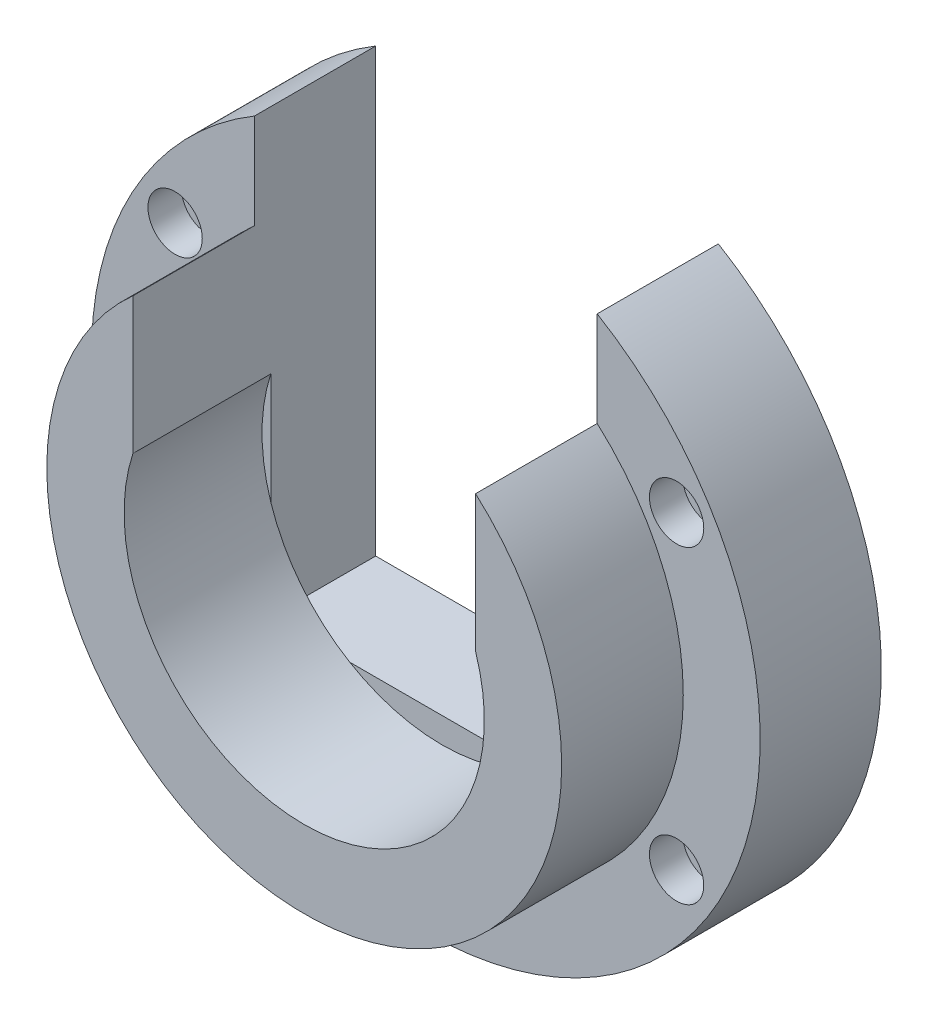
ISO-10303-21;
HEADER;
FILE_DESCRIPTION(('STEP AP214'),'2;1');
FILE_NAME('part.step','',(''),(''),'','','');
FILE_SCHEMA(('AUTOMOTIVE_DESIGN { 1 0 10303 214 1 1 1 1 }'));
ENDSEC;
DATA;
#1=APPLICATION_CONTEXT('core data for automotive mechanical design processes');
#2=APPLICATION_PROTOCOL_DEFINITION('international standard','automotive_design',2000,#1);
#3=PRODUCT_CONTEXT('',#1,'mechanical');
#4=PRODUCT('Part','Part','',(#3));
#5=PRODUCT_RELATED_PRODUCT_CATEGORY('part','',(#4));
#6=PRODUCT_DEFINITION_FORMATION('','',#4);
#7=PRODUCT_DEFINITION_CONTEXT('part definition',#1,'design');
#8=PRODUCT_DEFINITION('design','',#6,#7);
#9=PRODUCT_DEFINITION_SHAPE('','',#8);
#10=(LENGTH_UNIT() NAMED_UNIT(*) SI_UNIT(.MILLI.,.METRE.));
#11=(NAMED_UNIT(*) PLANE_ANGLE_UNIT() SI_UNIT($,.RADIAN.));
#12=(NAMED_UNIT(*) SI_UNIT($,.STERADIAN.) SOLID_ANGLE_UNIT());
#13=UNCERTAINTY_MEASURE_WITH_UNIT(LENGTH_MEASURE(1.E-05),#10,'distance_accuracy_value','');
#14=(GEOMETRIC_REPRESENTATION_CONTEXT(3) GLOBAL_UNCERTAINTY_ASSIGNED_CONTEXT((#13)) GLOBAL_UNIT_ASSIGNED_CONTEXT((#10,
#11,#12)) REPRESENTATION_CONTEXT('',''));
#15=CARTESIAN_POINT('',(0.,0.,0.));
#16=DIRECTION('',(0.,0.,1.));
#17=DIRECTION('',(1.,0.,0.));
#18=AXIS2_PLACEMENT_3D('',#15,#16,#17);
#19=CARTESIAN_POINT('',(30.,18.5084440188796,0.));
#20=DIRECTION('',(0.,0.,1.));
#21=DIRECTION('',(1.,0.,0.));
#22=AXIS2_PLACEMENT_3D('',#19,#20,#21);
#23=CYLINDRICAL_SURFACE('',#22,1.7);
#24=CARTESIAN_POINT('',(30.,18.5084440188796,0.));
#25=DIRECTION('',(0.,0.,1.));
#26=DIRECTION('',(1.,0.,0.));
#27=AXIS2_PLACEMENT_3D('',#24,#25,#26);
#28=CIRCLE('',#27,1.7);
#29=CARTESIAN_POINT('',(31.7,18.5084440188796,0.));
#30=VERTEX_POINT('',#29);
#31=EDGE_CURVE('E153',#30,#30,#28,.T.);
#32=CARTESIAN_POINT('',(30.,18.5084440188796,10.5));
#33=DIRECTION('',(0.,0.,1.));
#34=DIRECTION('',(1.,0.,0.));
#35=AXIS2_PLACEMENT_3D('',#32,#33,#34);
#36=CIRCLE('',#35,1.7);
#37=CARTESIAN_POINT('',(31.7,18.5084440188796,10.5));
#38=VERTEX_POINT('',#37);
#39=EDGE_CURVE('E45',#38,#38,#36,.F.);
#40=CARTESIAN_POINT('',(31.7,18.5084440188796,0.));
#41=CARTESIAN_POINT('',(31.7,18.5084440188796,0.109375));
#42=CARTESIAN_POINT('',(31.7,18.5084440188796,0.21875));
#43=CARTESIAN_POINT('',(31.7,18.5084440188796,0.4375));
#44=CARTESIAN_POINT('',(31.7,18.5084440188796,0.546875));
#45=CARTESIAN_POINT('',(31.7,18.5084440188796,0.765625));
#46=CARTESIAN_POINT('',(31.7,18.5084440188796,0.875));
#47=CARTESIAN_POINT('',(31.7,18.5084440188796,1.09375));
#48=CARTESIAN_POINT('',(31.7,18.5084440188796,1.203125));
#49=CARTESIAN_POINT('',(31.7,18.5084440188796,1.421875));
#50=CARTESIAN_POINT('',(31.7,18.5084440188796,1.53125));
#51=CARTESIAN_POINT('',(31.7,18.5084440188796,1.75));
#52=CARTESIAN_POINT('',(31.7,18.5084440188796,1.859375));
#53=CARTESIAN_POINT('',(31.7,18.5084440188796,2.078125));
#54=CARTESIAN_POINT('',(31.7,18.5084440188796,2.1875));
#55=CARTESIAN_POINT('',(31.7,18.5084440188796,2.40625));
#56=CARTESIAN_POINT('',(31.7,18.5084440188796,2.515625));
#57=CARTESIAN_POINT('',(31.7,18.5084440188796,2.734375));
#58=CARTESIAN_POINT('',(31.7,18.5084440188796,2.84375));
#59=CARTESIAN_POINT('',(31.7,18.5084440188796,3.0625));
#60=CARTESIAN_POINT('',(31.7,18.5084440188796,3.171875));
#61=CARTESIAN_POINT('',(31.7,18.5084440188796,3.390625));
#62=CARTESIAN_POINT('',(31.7,18.5084440188796,3.5));
#63=CARTESIAN_POINT('',(31.7,18.5084440188796,3.71875));
#64=CARTESIAN_POINT('',(31.7,18.5084440188796,3.828125));
#65=CARTESIAN_POINT('',(31.7,18.5084440188796,4.046875));
#66=CARTESIAN_POINT('',(31.7,18.5084440188796,4.15625));
#67=CARTESIAN_POINT('',(31.7,18.5084440188796,4.375));
#68=CARTESIAN_POINT('',(31.7,18.5084440188796,4.484375));
#69=CARTESIAN_POINT('',(31.7,18.5084440188796,4.703125));
#70=CARTESIAN_POINT('',(31.7,18.5084440188796,4.8125));
#71=CARTESIAN_POINT('',(31.7,18.5084440188796,5.03125));
#72=CARTESIAN_POINT('',(31.7,18.5084440188796,5.140625));
#73=CARTESIAN_POINT('',(31.7,18.5084440188796,5.359375));
#74=CARTESIAN_POINT('',(31.7,18.5084440188796,5.46875));
#75=CARTESIAN_POINT('',(31.7,18.5084440188796,5.6875));
#76=CARTESIAN_POINT('',(31.7,18.5084440188796,5.796875));
#77=CARTESIAN_POINT('',(31.7,18.5084440188796,6.015625));
#78=CARTESIAN_POINT('',(31.7,18.5084440188796,6.125));
#79=CARTESIAN_POINT('',(31.7,18.5084440188796,6.34375));
#80=CARTESIAN_POINT('',(31.7,18.5084440188796,6.453125));
#81=CARTESIAN_POINT('',(31.7,18.5084440188796,6.671875));
#82=CARTESIAN_POINT('',(31.7,18.5084440188796,6.78125));
#83=CARTESIAN_POINT('',(31.7,18.5084440188796,7.));
#84=CARTESIAN_POINT('',(31.7,18.5084440188796,7.109375));
#85=CARTESIAN_POINT('',(31.7,18.5084440188796,7.328125));
#86=CARTESIAN_POINT('',(31.7,18.5084440188796,7.4375));
#87=CARTESIAN_POINT('',(31.7,18.5084440188796,7.65625));
#88=CARTESIAN_POINT('',(31.7,18.5084440188796,7.765625));
#89=CARTESIAN_POINT('',(31.7,18.5084440188796,7.984375));
#90=CARTESIAN_POINT('',(31.7,18.5084440188796,8.09375));
#91=CARTESIAN_POINT('',(31.7,18.5084440188796,8.3125));
#92=CARTESIAN_POINT('',(31.7,18.5084440188796,8.421875));
#93=CARTESIAN_POINT('',(31.7,18.5084440188796,8.640625));
#94=CARTESIAN_POINT('',(31.7,18.5084440188796,8.75));
#95=CARTESIAN_POINT('',(31.7,18.5084440188796,8.96875));
#96=CARTESIAN_POINT('',(31.7,18.5084440188796,9.078125));
#97=CARTESIAN_POINT('',(31.7,18.5084440188796,9.296875));
#98=CARTESIAN_POINT('',(31.7,18.5084440188796,9.40625));
#99=CARTESIAN_POINT('',(31.7,18.5084440188796,9.625));
#100=CARTESIAN_POINT('',(31.7,18.5084440188796,9.734375));
#101=CARTESIAN_POINT('',(31.7,18.5084440188796,9.953125));
#102=CARTESIAN_POINT('',(31.7,18.5084440188796,10.0625));
#103=CARTESIAN_POINT('',(31.7,18.5084440188796,10.28125));
#104=CARTESIAN_POINT('',(31.7,18.5084440188796,10.390625));
#105=CARTESIAN_POINT('',(31.7,18.5084440188796,10.5));
#106=B_SPLINE_CURVE_WITH_KNOTS('',3,(#40,#41,#42,#43,#44,#45,#46,#47,#48,#49,#50,#51,#52,#53,
#54,#55,#56,#57,#58,#59,#60,#61,#62,#63,#64,#65,#66,#67,#68,#69,#70,#71,#72,#73,#74,#75,#76,#77,
#78,#79,#80,#81,#82,#83,#84,#85,#86,#87,#88,#89,#90,#91,#92,#93,#94,#95,#96,#97,#98,#99,#100,
#101,#102,#103,#104,#105),.UNSPECIFIED.,.F.,.F.,(4,2,2,2,2,2,2,2,2,2,2,2,2,2,2,2,2,2,2,2,2,2,2,
2,2,2,2,2,2,2,2,2,4),(0.,0.328125,0.65625,0.984375,1.3125,1.640625,1.96875,2.296875,2.625,
2.953125,3.28125,3.609375,3.9375,4.265625,4.59375,4.921875,5.25,5.578125,5.90625,6.234375,
6.5625,6.890625,7.21875,7.546875,7.875,8.203125,8.53125,8.859375,9.1875,9.515625,9.84375,
10.171875,10.5),.UNSPECIFIED.);
#107=EDGE_CURVE('BSEAM41',#30,#38,#106,.T.);
#108=ORIENTED_EDGE('',*,*,#31,.F.);
#109=ORIENTED_EDGE('',*,*,#39,.F.);
#110=ORIENTED_EDGE('',*,*,#107,.T.);
#111=ORIENTED_EDGE('',*,*,#107,.F.);
#112=EDGE_LOOP('',(#108,#110,#109,#111));
#113=FACE_BOUND('',#112,.T.);
#114=ADVANCED_FACE('F41',(#113),#23,.F.);
#115=CARTESIAN_POINT('',(-30.,-18.5084440188796,0.));
#116=DIRECTION('',(0.,0.,1.));
#117=DIRECTION('',(1.,0.,0.));
#118=AXIS2_PLACEMENT_3D('',#115,#116,#117);
#119=CYLINDRICAL_SURFACE('',#118,1.7);
#120=CARTESIAN_POINT('',(-30.,-18.5084440188796,0.));
#121=DIRECTION('',(0.,0.,1.));
#122=DIRECTION('',(1.,0.,0.));
#123=AXIS2_PLACEMENT_3D('',#120,#121,#122);
#124=CIRCLE('',#123,1.7);
#125=CARTESIAN_POINT('',(-28.3,-18.5084440188796,0.));
#126=VERTEX_POINT('',#125);
#127=EDGE_CURVE('E137',#126,#126,#124,.T.);
#128=CARTESIAN_POINT('',(-30.,-18.5084440188796,10.5));
#129=DIRECTION('',(0.,0.,1.));
#130=DIRECTION('',(1.,0.,0.));
#131=AXIS2_PLACEMENT_3D('',#128,#129,#130);
#132=CIRCLE('',#131,1.7);
#133=CARTESIAN_POINT('',(-28.3,-18.5084440188796,10.5));
#134=VERTEX_POINT('',#133);
#135=EDGE_CURVE('E132',#134,#134,#132,.F.);
#136=CARTESIAN_POINT('',(-28.3,-18.5084440188796,0.));
#137=CARTESIAN_POINT('',(-28.3,-18.5084440188796,0.109375));
#138=CARTESIAN_POINT('',(-28.3,-18.5084440188796,0.21875));
#139=CARTESIAN_POINT('',(-28.3,-18.5084440188796,0.4375));
#140=CARTESIAN_POINT('',(-28.3,-18.5084440188796,0.546875));
#141=CARTESIAN_POINT('',(-28.3,-18.5084440188796,0.765625));
#142=CARTESIAN_POINT('',(-28.3,-18.5084440188796,0.875));
#143=CARTESIAN_POINT('',(-28.3,-18.5084440188796,1.09375));
#144=CARTESIAN_POINT('',(-28.3,-18.5084440188796,1.203125));
#145=CARTESIAN_POINT('',(-28.3,-18.5084440188796,1.421875));
#146=CARTESIAN_POINT('',(-28.3,-18.5084440188796,1.53125));
#147=CARTESIAN_POINT('',(-28.3,-18.5084440188796,1.75));
#148=CARTESIAN_POINT('',(-28.3,-18.5084440188796,1.859375));
#149=CARTESIAN_POINT('',(-28.3,-18.5084440188796,2.078125));
#150=CARTESIAN_POINT('',(-28.3,-18.5084440188796,2.1875));
#151=CARTESIAN_POINT('',(-28.3,-18.5084440188796,2.40625));
#152=CARTESIAN_POINT('',(-28.3,-18.5084440188796,2.515625));
#153=CARTESIAN_POINT('',(-28.3,-18.5084440188796,2.734375));
#154=CARTESIAN_POINT('',(-28.3,-18.5084440188796,2.84375));
#155=CARTESIAN_POINT('',(-28.3,-18.5084440188796,3.0625));
#156=CARTESIAN_POINT('',(-28.3,-18.5084440188796,3.171875));
#157=CARTESIAN_POINT('',(-28.3,-18.5084440188796,3.390625));
#158=CARTESIAN_POINT('',(-28.3,-18.5084440188796,3.5));
#159=CARTESIAN_POINT('',(-28.3,-18.5084440188796,3.71875));
#160=CARTESIAN_POINT('',(-28.3,-18.5084440188796,3.828125));
#161=CARTESIAN_POINT('',(-28.3,-18.5084440188796,4.046875));
#162=CARTESIAN_POINT('',(-28.3,-18.5084440188796,4.15625));
#163=CARTESIAN_POINT('',(-28.3,-18.5084440188796,4.375));
#164=CARTESIAN_POINT('',(-28.3,-18.5084440188796,4.484375));
#165=CARTESIAN_POINT('',(-28.3,-18.5084440188796,4.703125));
#166=CARTESIAN_POINT('',(-28.3,-18.5084440188796,4.8125));
#167=CARTESIAN_POINT('',(-28.3,-18.5084440188796,5.03125));
#168=CARTESIAN_POINT('',(-28.3,-18.5084440188796,5.140625));
#169=CARTESIAN_POINT('',(-28.3,-18.5084440188796,5.359375));
#170=CARTESIAN_POINT('',(-28.3,-18.5084440188796,5.46875));
#171=CARTESIAN_POINT('',(-28.3,-18.5084440188796,5.6875));
#172=CARTESIAN_POINT('',(-28.3,-18.5084440188796,5.796875));
#173=CARTESIAN_POINT('',(-28.3,-18.5084440188796,6.015625));
#174=CARTESIAN_POINT('',(-28.3,-18.5084440188796,6.125));
#175=CARTESIAN_POINT('',(-28.3,-18.5084440188796,6.34375));
#176=CARTESIAN_POINT('',(-28.3,-18.5084440188796,6.453125));
#177=CARTESIAN_POINT('',(-28.3,-18.5084440188796,6.671875));
#178=CARTESIAN_POINT('',(-28.3,-18.5084440188796,6.78125));
#179=CARTESIAN_POINT('',(-28.3,-18.5084440188796,7.));
#180=CARTESIAN_POINT('',(-28.3,-18.5084440188796,7.109375));
#181=CARTESIAN_POINT('',(-28.3,-18.5084440188796,7.328125));
#182=CARTESIAN_POINT('',(-28.3,-18.5084440188796,7.4375));
#183=CARTESIAN_POINT('',(-28.3,-18.5084440188796,7.65625));
#184=CARTESIAN_POINT('',(-28.3,-18.5084440188796,7.765625));
#185=CARTESIAN_POINT('',(-28.3,-18.5084440188796,7.984375));
#186=CARTESIAN_POINT('',(-28.3,-18.5084440188796,8.09375));
#187=CARTESIAN_POINT('',(-28.3,-18.5084440188796,8.3125));
#188=CARTESIAN_POINT('',(-28.3,-18.5084440188796,8.421875));
#189=CARTESIAN_POINT('',(-28.3,-18.5084440188796,8.640625));
#190=CARTESIAN_POINT('',(-28.3,-18.5084440188796,8.75));
#191=CARTESIAN_POINT('',(-28.3,-18.5084440188796,8.96875));
#192=CARTESIAN_POINT('',(-28.3,-18.5084440188796,9.078125));
#193=CARTESIAN_POINT('',(-28.3,-18.5084440188796,9.296875));
#194=CARTESIAN_POINT('',(-28.3,-18.5084440188796,9.40625));
#195=CARTESIAN_POINT('',(-28.3,-18.5084440188796,9.625));
#196=CARTESIAN_POINT('',(-28.3,-18.5084440188796,9.734375));
#197=CARTESIAN_POINT('',(-28.3,-18.5084440188796,9.953125));
#198=CARTESIAN_POINT('',(-28.3,-18.5084440188796,10.0625));
#199=CARTESIAN_POINT('',(-28.3,-18.5084440188796,10.28125));
#200=CARTESIAN_POINT('',(-28.3,-18.5084440188796,10.390625));
#201=CARTESIAN_POINT('',(-28.3,-18.5084440188796,10.5));
#202=B_SPLINE_CURVE_WITH_KNOTS('',3,(#136,#137,#138,#139,#140,#141,#142,#143,#144,#145,#146,
#147,#148,#149,#150,#151,#152,#153,#154,#155,#156,#157,#158,#159,#160,#161,#162,#163,#164,#165,
#166,#167,#168,#169,#170,#171,#172,#173,#174,#175,#176,#177,#178,#179,#180,#181,#182,#183,#184,
#185,#186,#187,#188,#189,#190,#191,#192,#193,#194,#195,#196,#197,#198,#199,#200,#201),
.UNSPECIFIED.,.F.,.F.,(4,2,2,2,2,2,2,2,2,2,2,2,2,2,2,2,2,2,2,2,2,2,2,2,2,2,2,2,2,2,2,2,4),(0.,
0.328125,0.65625,0.984375,1.3125,1.640625,1.96875,2.296875,2.625,2.953125,3.28125,3.609375,
3.9375,4.265625,4.59375,4.921875,5.25,5.578125,5.90625,6.234375,6.5625,6.890625,7.21875,
7.546875,7.875,8.203125,8.53125,8.859375,9.1875,9.515625,9.84375,10.171875,10.5),.UNSPECIFIED.);
#203=EDGE_CURVE('BSEAM248',#126,#134,#202,.T.);
#204=ORIENTED_EDGE('',*,*,#127,.F.);
#205=ORIENTED_EDGE('',*,*,#135,.F.);
#206=ORIENTED_EDGE('',*,*,#203,.T.);
#207=ORIENTED_EDGE('',*,*,#203,.F.);
#208=EDGE_LOOP('',(#204,#206,#205,#207));
#209=FACE_BOUND('',#208,.T.);
#210=ADVANCED_FACE('F248',(#209),#119,.F.);
#211=CARTESIAN_POINT('',(-30.,18.5084440188796,0.));
#212=DIRECTION('',(0.,0.,1.));
#213=DIRECTION('',(1.,0.,0.));
#214=AXIS2_PLACEMENT_3D('',#211,#212,#213);
#215=CYLINDRICAL_SURFACE('',#214,1.7);
#216=CARTESIAN_POINT('',(-30.,18.5084440188796,0.));
#217=DIRECTION('',(0.,0.,1.));
#218=DIRECTION('',(1.,0.,0.));
#219=AXIS2_PLACEMENT_3D('',#216,#217,#218);
#220=CIRCLE('',#219,1.7);
#221=CARTESIAN_POINT('',(-28.3,18.5084440188796,0.));
#222=VERTEX_POINT('',#221);
#223=EDGE_CURVE('E141',#222,#222,#220,.T.);
#224=CARTESIAN_POINT('',(-30.,18.5084440188796,10.5));
#225=DIRECTION('',(0.,0.,1.));
#226=DIRECTION('',(1.,0.,0.));
#227=AXIS2_PLACEMENT_3D('',#224,#225,#226);
#228=CIRCLE('',#227,1.7);
#229=CARTESIAN_POINT('',(-28.3,18.5084440188796,10.5));
#230=VERTEX_POINT('',#229);
#231=EDGE_CURVE('E129',#230,#230,#228,.F.);
#232=CARTESIAN_POINT('',(-28.3,18.5084440188796,0.));
#233=CARTESIAN_POINT('',(-28.3,18.5084440188796,0.109375));
#234=CARTESIAN_POINT('',(-28.3,18.5084440188796,0.21875));
#235=CARTESIAN_POINT('',(-28.3,18.5084440188796,0.4375));
#236=CARTESIAN_POINT('',(-28.3,18.5084440188796,0.546875));
#237=CARTESIAN_POINT('',(-28.3,18.5084440188796,0.765625));
#238=CARTESIAN_POINT('',(-28.3,18.5084440188796,0.875));
#239=CARTESIAN_POINT('',(-28.3,18.5084440188796,1.09375));
#240=CARTESIAN_POINT('',(-28.3,18.5084440188796,1.203125));
#241=CARTESIAN_POINT('',(-28.3,18.5084440188796,1.421875));
#242=CARTESIAN_POINT('',(-28.3,18.5084440188796,1.53125));
#243=CARTESIAN_POINT('',(-28.3,18.5084440188796,1.75));
#244=CARTESIAN_POINT('',(-28.3,18.5084440188796,1.859375));
#245=CARTESIAN_POINT('',(-28.3,18.5084440188796,2.078125));
#246=CARTESIAN_POINT('',(-28.3,18.5084440188796,2.1875));
#247=CARTESIAN_POINT('',(-28.3,18.5084440188796,2.40625));
#248=CARTESIAN_POINT('',(-28.3,18.5084440188796,2.515625));
#249=CARTESIAN_POINT('',(-28.3,18.5084440188796,2.734375));
#250=CARTESIAN_POINT('',(-28.3,18.5084440188796,2.84375));
#251=CARTESIAN_POINT('',(-28.3,18.5084440188796,3.0625));
#252=CARTESIAN_POINT('',(-28.3,18.5084440188796,3.171875));
#253=CARTESIAN_POINT('',(-28.3,18.5084440188796,3.390625));
#254=CARTESIAN_POINT('',(-28.3,18.5084440188796,3.5));
#255=CARTESIAN_POINT('',(-28.3,18.5084440188796,3.71875));
#256=CARTESIAN_POINT('',(-28.3,18.5084440188796,3.828125));
#257=CARTESIAN_POINT('',(-28.3,18.5084440188796,4.046875));
#258=CARTESIAN_POINT('',(-28.3,18.5084440188796,4.15625));
#259=CARTESIAN_POINT('',(-28.3,18.5084440188796,4.375));
#260=CARTESIAN_POINT('',(-28.3,18.5084440188796,4.484375));
#261=CARTESIAN_POINT('',(-28.3,18.5084440188796,4.703125));
#262=CARTESIAN_POINT('',(-28.3,18.5084440188796,4.8125));
#263=CARTESIAN_POINT('',(-28.3,18.5084440188796,5.03125));
#264=CARTESIAN_POINT('',(-28.3,18.5084440188796,5.140625));
#265=CARTESIAN_POINT('',(-28.3,18.5084440188796,5.359375));
#266=CARTESIAN_POINT('',(-28.3,18.5084440188796,5.46875));
#267=CARTESIAN_POINT('',(-28.3,18.5084440188796,5.6875));
#268=CARTESIAN_POINT('',(-28.3,18.5084440188796,5.796875));
#269=CARTESIAN_POINT('',(-28.3,18.5084440188796,6.015625));
#270=CARTESIAN_POINT('',(-28.3,18.5084440188796,6.125));
#271=CARTESIAN_POINT('',(-28.3,18.5084440188796,6.34375));
#272=CARTESIAN_POINT('',(-28.3,18.5084440188796,6.453125));
#273=CARTESIAN_POINT('',(-28.3,18.5084440188796,6.671875));
#274=CARTESIAN_POINT('',(-28.3,18.5084440188796,6.78125));
#275=CARTESIAN_POINT('',(-28.3,18.5084440188796,7.));
#276=CARTESIAN_POINT('',(-28.3,18.5084440188796,7.109375));
#277=CARTESIAN_POINT('',(-28.3,18.5084440188796,7.328125));
#278=CARTESIAN_POINT('',(-28.3,18.5084440188796,7.4375));
#279=CARTESIAN_POINT('',(-28.3,18.5084440188796,7.65625));
#280=CARTESIAN_POINT('',(-28.3,18.5084440188796,7.765625));
#281=CARTESIAN_POINT('',(-28.3,18.5084440188796,7.984375));
#282=CARTESIAN_POINT('',(-28.3,18.5084440188796,8.09375));
#283=CARTESIAN_POINT('',(-28.3,18.5084440188796,8.3125));
#284=CARTESIAN_POINT('',(-28.3,18.5084440188796,8.421875));
#285=CARTESIAN_POINT('',(-28.3,18.5084440188796,8.640625));
#286=CARTESIAN_POINT('',(-28.3,18.5084440188796,8.75));
#287=CARTESIAN_POINT('',(-28.3,18.5084440188796,8.96875));
#288=CARTESIAN_POINT('',(-28.3,18.5084440188796,9.078125));
#289=CARTESIAN_POINT('',(-28.3,18.5084440188796,9.296875));
#290=CARTESIAN_POINT('',(-28.3,18.5084440188796,9.40625));
#291=CARTESIAN_POINT('',(-28.3,18.5084440188796,9.625));
#292=CARTESIAN_POINT('',(-28.3,18.5084440188796,9.734375));
#293=CARTESIAN_POINT('',(-28.3,18.5084440188796,9.953125));
#294=CARTESIAN_POINT('',(-28.3,18.5084440188796,10.0625));
#295=CARTESIAN_POINT('',(-28.3,18.5084440188796,10.28125));
#296=CARTESIAN_POINT('',(-28.3,18.5084440188796,10.390625));
#297=CARTESIAN_POINT('',(-28.3,18.5084440188796,10.5));
#298=B_SPLINE_CURVE_WITH_KNOTS('',3,(#232,#233,#234,#235,#236,#237,#238,#239,#240,#241,#242,
#243,#244,#245,#246,#247,#248,#249,#250,#251,#252,#253,#254,#255,#256,#257,#258,#259,#260,#261,
#262,#263,#264,#265,#266,#267,#268,#269,#270,#271,#272,#273,#274,#275,#276,#277,#278,#279,#280,
#281,#282,#283,#284,#285,#286,#287,#288,#289,#290,#291,#292,#293,#294,#295,#296,#297),
.UNSPECIFIED.,.F.,.F.,(4,2,2,2,2,2,2,2,2,2,2,2,2,2,2,2,2,2,2,2,2,2,2,2,2,2,2,2,2,2,2,2,4),(0.,
0.328125,0.65625,0.984375,1.3125,1.640625,1.96875,2.296875,2.625,2.953125,3.28125,3.609375,
3.9375,4.265625,4.59375,4.921875,5.25,5.578125,5.90625,6.234375,6.5625,6.890625,7.21875,
7.546875,7.875,8.203125,8.53125,8.859375,9.1875,9.515625,9.84375,10.171875,10.5),.UNSPECIFIED.);
#299=EDGE_CURVE('BSEAM254',#222,#230,#298,.T.);
#300=ORIENTED_EDGE('',*,*,#223,.F.);
#301=ORIENTED_EDGE('',*,*,#231,.F.);
#302=ORIENTED_EDGE('',*,*,#299,.T.);
#303=ORIENTED_EDGE('',*,*,#299,.F.);
#304=EDGE_LOOP('',(#300,#302,#301,#303));
#305=FACE_BOUND('',#304,.T.);
#306=ADVANCED_FACE('F254',(#305),#215,.F.);
#307=CARTESIAN_POINT('',(30.,-18.5084440188796,0.));
#308=DIRECTION('',(0.,0.,1.));
#309=DIRECTION('',(1.,0.,0.));
#310=AXIS2_PLACEMENT_3D('',#307,#308,#309);
#311=CYLINDRICAL_SURFACE('',#310,1.7);
#312=CARTESIAN_POINT('',(30.,-18.5084440188796,0.));
#313=DIRECTION('',(0.,0.,1.));
#314=DIRECTION('',(1.,0.,0.));
#315=AXIS2_PLACEMENT_3D('',#312,#313,#314);
#316=CIRCLE('',#315,1.7);
#317=CARTESIAN_POINT('',(31.7,-18.5084440188796,0.));
#318=VERTEX_POINT('',#317);
#319=EDGE_CURVE('E146',#318,#318,#316,.T.);
#320=CARTESIAN_POINT('',(30.,-18.5084440188796,10.5));
#321=DIRECTION('',(0.,0.,1.));
#322=DIRECTION('',(1.,0.,0.));
#323=AXIS2_PLACEMENT_3D('',#320,#321,#322);
#324=CIRCLE('',#323,1.7);
#325=CARTESIAN_POINT('',(31.7,-18.5084440188796,10.5));
#326=VERTEX_POINT('',#325);
#327=EDGE_CURVE('E126',#326,#326,#324,.F.);
#328=CARTESIAN_POINT('',(31.7,-18.5084440188796,0.));
#329=CARTESIAN_POINT('',(31.7,-18.5084440188796,0.109375));
#330=CARTESIAN_POINT('',(31.7,-18.5084440188796,0.21875));
#331=CARTESIAN_POINT('',(31.7,-18.5084440188796,0.4375));
#332=CARTESIAN_POINT('',(31.7,-18.5084440188796,0.546875));
#333=CARTESIAN_POINT('',(31.7,-18.5084440188796,0.765625));
#334=CARTESIAN_POINT('',(31.7,-18.5084440188796,0.875));
#335=CARTESIAN_POINT('',(31.7,-18.5084440188796,1.09375));
#336=CARTESIAN_POINT('',(31.7,-18.5084440188796,1.203125));
#337=CARTESIAN_POINT('',(31.7,-18.5084440188796,1.421875));
#338=CARTESIAN_POINT('',(31.7,-18.5084440188796,1.53125));
#339=CARTESIAN_POINT('',(31.7,-18.5084440188796,1.75));
#340=CARTESIAN_POINT('',(31.7,-18.5084440188796,1.859375));
#341=CARTESIAN_POINT('',(31.7,-18.5084440188796,2.078125));
#342=CARTESIAN_POINT('',(31.7,-18.5084440188796,2.1875));
#343=CARTESIAN_POINT('',(31.7,-18.5084440188796,2.40625));
#344=CARTESIAN_POINT('',(31.7,-18.5084440188796,2.515625));
#345=CARTESIAN_POINT('',(31.7,-18.5084440188796,2.734375));
#346=CARTESIAN_POINT('',(31.7,-18.5084440188796,2.84375));
#347=CARTESIAN_POINT('',(31.7,-18.5084440188796,3.0625));
#348=CARTESIAN_POINT('',(31.7,-18.5084440188796,3.171875));
#349=CARTESIAN_POINT('',(31.7,-18.5084440188796,3.390625));
#350=CARTESIAN_POINT('',(31.7,-18.5084440188796,3.5));
#351=CARTESIAN_POINT('',(31.7,-18.5084440188796,3.71875));
#352=CARTESIAN_POINT('',(31.7,-18.5084440188796,3.828125));
#353=CARTESIAN_POINT('',(31.7,-18.5084440188796,4.046875));
#354=CARTESIAN_POINT('',(31.7,-18.5084440188796,4.15625));
#355=CARTESIAN_POINT('',(31.7,-18.5084440188796,4.375));
#356=CARTESIAN_POINT('',(31.7,-18.5084440188796,4.484375));
#357=CARTESIAN_POINT('',(31.7,-18.5084440188796,4.703125));
#358=CARTESIAN_POINT('',(31.7,-18.5084440188796,4.8125));
#359=CARTESIAN_POINT('',(31.7,-18.5084440188796,5.03125));
#360=CARTESIAN_POINT('',(31.7,-18.5084440188796,5.140625));
#361=CARTESIAN_POINT('',(31.7,-18.5084440188796,5.359375));
#362=CARTESIAN_POINT('',(31.7,-18.5084440188796,5.46875));
#363=CARTESIAN_POINT('',(31.7,-18.5084440188796,5.6875));
#364=CARTESIAN_POINT('',(31.7,-18.5084440188796,5.796875));
#365=CARTESIAN_POINT('',(31.7,-18.5084440188796,6.015625));
#366=CARTESIAN_POINT('',(31.7,-18.5084440188796,6.125));
#367=CARTESIAN_POINT('',(31.7,-18.5084440188796,6.34375));
#368=CARTESIAN_POINT('',(31.7,-18.5084440188796,6.453125));
#369=CARTESIAN_POINT('',(31.7,-18.5084440188796,6.671875));
#370=CARTESIAN_POINT('',(31.7,-18.5084440188796,6.78125));
#371=CARTESIAN_POINT('',(31.7,-18.5084440188796,7.));
#372=CARTESIAN_POINT('',(31.7,-18.5084440188796,7.109375));
#373=CARTESIAN_POINT('',(31.7,-18.5084440188796,7.328125));
#374=CARTESIAN_POINT('',(31.7,-18.5084440188796,7.4375));
#375=CARTESIAN_POINT('',(31.7,-18.5084440188796,7.65625));
#376=CARTESIAN_POINT('',(31.7,-18.5084440188796,7.765625));
#377=CARTESIAN_POINT('',(31.7,-18.5084440188796,7.984375));
#378=CARTESIAN_POINT('',(31.7,-18.5084440188796,8.09375));
#379=CARTESIAN_POINT('',(31.7,-18.5084440188796,8.3125));
#380=CARTESIAN_POINT('',(31.7,-18.5084440188796,8.421875));
#381=CARTESIAN_POINT('',(31.7,-18.5084440188796,8.640625));
#382=CARTESIAN_POINT('',(31.7,-18.5084440188796,8.75));
#383=CARTESIAN_POINT('',(31.7,-18.5084440188796,8.96875));
#384=CARTESIAN_POINT('',(31.7,-18.5084440188796,9.078125));
#385=CARTESIAN_POINT('',(31.7,-18.5084440188796,9.296875));
#386=CARTESIAN_POINT('',(31.7,-18.5084440188796,9.40625));
#387=CARTESIAN_POINT('',(31.7,-18.5084440188796,9.625));
#388=CARTESIAN_POINT('',(31.7,-18.5084440188796,9.734375));
#389=CARTESIAN_POINT('',(31.7,-18.5084440188796,9.953125));
#390=CARTESIAN_POINT('',(31.7,-18.5084440188796,10.0625));
#391=CARTESIAN_POINT('',(31.7,-18.5084440188796,10.28125));
#392=CARTESIAN_POINT('',(31.7,-18.5084440188796,10.390625));
#393=CARTESIAN_POINT('',(31.7,-18.5084440188796,10.5));
#394=B_SPLINE_CURVE_WITH_KNOTS('',3,(#328,#329,#330,#331,#332,#333,#334,#335,#336,#337,#338,
#339,#340,#341,#342,#343,#344,#345,#346,#347,#348,#349,#350,#351,#352,#353,#354,#355,#356,#357,
#358,#359,#360,#361,#362,#363,#364,#365,#366,#367,#368,#369,#370,#371,#372,#373,#374,#375,#376,
#377,#378,#379,#380,#381,#382,#383,#384,#385,#386,#387,#388,#389,#390,#391,#392,#393),
.UNSPECIFIED.,.F.,.F.,(4,2,2,2,2,2,2,2,2,2,2,2,2,2,2,2,2,2,2,2,2,2,2,2,2,2,2,2,2,2,2,2,4),(0.,
0.328125,0.65625,0.984375,1.3125,1.640625,1.96875,2.296875,2.625,2.953125,3.28125,3.609375,
3.9375,4.265625,4.59375,4.921875,5.25,5.578125,5.90625,6.234375,6.5625,6.890625,7.21875,
7.546875,7.875,8.203125,8.53125,8.859375,9.1875,9.515625,9.84375,10.171875,10.5),.UNSPECIFIED.);
#395=EDGE_CURVE('BSEAM349',#318,#326,#394,.T.);
#396=ORIENTED_EDGE('',*,*,#319,.F.);
#397=ORIENTED_EDGE('',*,*,#327,.F.);
#398=ORIENTED_EDGE('',*,*,#395,.T.);
#399=ORIENTED_EDGE('',*,*,#395,.F.);
#400=EDGE_LOOP('',(#396,#398,#397,#399));
#401=FACE_BOUND('',#400,.T.);
#402=ADVANCED_FACE('F349',(#401),#311,.F.);
#403=CARTESIAN_POINT('',(-20.5,0.,14.5));
#404=DIRECTION('',(1.,0.,0.));
#405=DIRECTION('',(0.,1.,0.));
#406=AXIS2_PLACEMENT_3D('',#403,#404,#405);
#407=PLANE('',#406);
#408=DIRECTION('',(0.,-1.,0.));
#409=VECTOR('',#408,1.);
#410=CARTESIAN_POINT('',(-20.5,0.,14.5));
#411=LINE('',#410,#409);
#412=CARTESIAN_POINT('',(-20.5,34.3474889911912,14.5));
#413=VERTEX_POINT('',#412);
#414=CARTESIAN_POINT('',(-20.5,22.9867353053886,14.5));
#415=VERTEX_POINT('',#414);
#416=EDGE_CURVE('E111',#413,#415,#411,.T.);
#417=ORIENTED_EDGE('',*,*,#416,.T.);
#418=DIRECTION('',(0.,0.,-1.));
#419=VECTOR('',#418,1.);
#420=CARTESIAN_POINT('',(-20.5,22.9867353053886,29.05));
#421=LINE('',#420,#419);
#422=CARTESIAN_POINT('',(-20.5,22.9867353053886,29.05));
#423=VERTEX_POINT('',#422);
#424=EDGE_CURVE('E173',#423,#415,#421,.T.);
#425=ORIENTED_EDGE('',*,*,#424,.F.);
#426=DIRECTION('',(0.,1.,0.));
#427=VECTOR('',#426,1.);
#428=CARTESIAN_POINT('',(-20.5,0.,29.05));
#429=LINE('',#428,#427);
#430=CARTESIAN_POINT('',(-20.5,6.64473475768591,29.05));
#431=VERTEX_POINT('',#430);
#432=EDGE_CURVE('E168',#431,#423,#429,.T.);
#433=ORIENTED_EDGE('',*,*,#432,.F.);
#434=DIRECTION('',(0.,0.,1.));
#435=VECTOR('',#434,1.);
#436=CARTESIAN_POINT('',(-20.5,6.64473475768593,-60.9526045382804));
#437=LINE('',#436,#435);
#438=CARTESIAN_POINT('',(-20.5,6.64473475768591,12.55));
#439=VERTEX_POINT('',#438);
#440=EDGE_CURVE('E192',#439,#431,#437,.T.);
#441=ORIENTED_EDGE('',*,*,#440,.F.);
#442=DIRECTION('',(0.,-1.,0.));
#443=VECTOR('',#442,1.);
#444=CARTESIAN_POINT('',(-20.5,0.,12.55));
#445=LINE('',#444,#443);
#446=CARTESIAN_POINT('',(-20.5,-6.64473475768591,12.55));
#447=VERTEX_POINT('',#446);
#448=EDGE_CURVE('E105',#439,#447,#445,.T.);
#449=ORIENTED_EDGE('',*,*,#448,.T.);
#450=DIRECTION('',(0.,-1.,0.));
#451=VECTOR('',#450,1.);
#452=CARTESIAN_POINT('',(-20.5,0.,12.55));
#453=LINE('',#452,#451);
#454=CARTESIAN_POINT('',(-20.5,-18.5,12.55));
#455=VERTEX_POINT('',#454);
#456=EDGE_CURVE('E91',#447,#455,#453,.T.);
#457=ORIENTED_EDGE('',*,*,#456,.T.);
#458=DIRECTION('',(0.,0.,-1.));
#459=VECTOR('',#458,1.);
#460=CARTESIAN_POINT('',(-20.5,-18.5,14.5));
#461=LINE('',#460,#459);
#462=CARTESIAN_POINT('',(-20.5,-18.5,0.));
#463=VERTEX_POINT('',#462);
#464=EDGE_CURVE('E84',#455,#463,#461,.T.);
#465=ORIENTED_EDGE('',*,*,#464,.T.);
#466=DIRECTION('',(0.,-1.,0.));
#467=VECTOR('',#466,1.);
#468=CARTESIAN_POINT('',(-20.5,0.,0.));
#469=LINE('',#468,#467);
#470=CARTESIAN_POINT('',(-20.5,34.3474889911912,0.));
#471=VERTEX_POINT('',#470);
#472=EDGE_CURVE('E87',#471,#463,#469,.T.);
#473=ORIENTED_EDGE('',*,*,#472,.F.);
#474=DIRECTION('',(0.,0.,-1.));
#475=VECTOR('',#474,1.);
#476=CARTESIAN_POINT('',(-20.5,34.3474889911912,14.5));
#477=LINE('',#476,#475);
#478=EDGE_CURVE('E122',#413,#471,#477,.T.);
#479=ORIENTED_EDGE('',*,*,#478,.F.);
#480=EDGE_LOOP('',(#417,#425,#433,#441,#449,#457,#465,#473,#479));
#481=FACE_BOUND('',#480,.T.);
#482=ADVANCED_FACE('F43',(#481),#407,.T.);
#483=CARTESIAN_POINT('',(0.,-18.5,14.5));
#484=DIRECTION('',(0.,1.,0.));
#485=DIRECTION('',(0.,0.,1.));
#486=AXIS2_PLACEMENT_3D('',#483,#484,#485);
#487=PLANE('',#486);
#488=ORIENTED_EDGE('',*,*,#464,.F.);
#489=DIRECTION('',(1.,0.,0.));
#490=VECTOR('',#489,1.);
#491=CARTESIAN_POINT('',(0.,-18.5,12.55));
#492=LINE('',#491,#490);
#493=CARTESIAN_POINT('',(-11.0522622118732,-18.5,12.55));
#494=VERTEX_POINT('',#493);
#495=EDGE_CURVE('E180',#455,#494,#492,.T.);
#496=ORIENTED_EDGE('',*,*,#495,.T.);
#497=DIRECTION('',(1.,0.,0.));
#498=VECTOR('',#497,1.);
#499=CARTESIAN_POINT('',(0.,-18.5,12.55));
#500=LINE('',#499,#498);
#501=CARTESIAN_POINT('',(11.0522622118732,-18.5,12.55));
#502=VERTEX_POINT('',#501);
#503=EDGE_CURVE('E50',#494,#502,#500,.T.);
#504=ORIENTED_EDGE('',*,*,#503,.T.);
#505=CARTESIAN_POINT('',(20.5,-18.5,12.55));
#506=VERTEX_POINT('',#505);
#507=EDGE_CURVE('E176',#502,#506,#492,.T.);
#508=ORIENTED_EDGE('',*,*,#507,.T.);
#509=DIRECTION('',(0.,0.,-1.));
#510=VECTOR('',#509,1.);
#511=CARTESIAN_POINT('',(20.5,-18.5,14.5));
#512=LINE('',#511,#510);
#513=CARTESIAN_POINT('',(20.5,-18.5,0.));
#514=VERTEX_POINT('',#513);
#515=EDGE_CURVE('E95',#506,#514,#512,.T.);
#516=ORIENTED_EDGE('',*,*,#515,.T.);
#517=DIRECTION('',(1.,0.,0.));
#518=VECTOR('',#517,1.);
#519=CARTESIAN_POINT('',(0.,-18.5,0.));
#520=LINE('',#519,#518);
#521=EDGE_CURVE('E102',#463,#514,#520,.T.);
#522=ORIENTED_EDGE('',*,*,#521,.F.);
#523=EDGE_LOOP('',(#488,#496,#504,#508,#516,#522));
#524=FACE_BOUND('',#523,.T.);
#525=ADVANCED_FACE('F107',(#524),#487,.T.);
#526=CARTESIAN_POINT('',(0.,0.,14.5));
#527=DIRECTION('',(0.,0.,1.));
#528=DIRECTION('',(1.,0.,0.));
#529=AXIS2_PLACEMENT_3D('',#526,#527,#528);
#530=PLANE('',#529);
#531=CARTESIAN_POINT('',(-30.,-18.5084440188796,14.5));
#532=DIRECTION('',(0.,0.,1.));
#533=DIRECTION('',(1.,0.,0.));
#534=AXIS2_PLACEMENT_3D('',#531,#532,#533);
#535=CIRCLE('',#534,3.25);
#536=CARTESIAN_POINT('',(-26.75,-18.5084440188796,14.5));
#537=VERTEX_POINT('',#536);
#538=EDGE_CURVE('E481',#537,#537,#535,.T.);
#539=ORIENTED_EDGE('',*,*,#538,.F.);
#540=EDGE_LOOP('',(#539));
#541=FACE_BOUND('',#540,.T.);
#542=CARTESIAN_POINT('',(30.,-18.5084440188796,14.5));
#543=DIRECTION('',(0.,0.,1.));
#544=DIRECTION('',(1.,0.,0.));
#545=AXIS2_PLACEMENT_3D('',#542,#543,#544);
#546=CIRCLE('',#545,3.25);
#547=CARTESIAN_POINT('',(33.25,-18.5084440188796,14.5));
#548=VERTEX_POINT('',#547);
#549=EDGE_CURVE('E473',#548,#548,#546,.T.);
#550=ORIENTED_EDGE('',*,*,#549,.F.);
#551=EDGE_LOOP('',(#550));
#552=FACE_BOUND('',#551,.T.);
#553=CARTESIAN_POINT('',(30.,18.5084440188796,14.5));
#554=DIRECTION('',(0.,0.,1.));
#555=DIRECTION('',(1.,0.,0.));
#556=AXIS2_PLACEMENT_3D('',#553,#554,#555);
#557=CIRCLE('',#556,3.25);
#558=CARTESIAN_POINT('',(33.25,18.5084440188796,14.5));
#559=VERTEX_POINT('',#558);
#560=EDGE_CURVE('E469',#559,#559,#557,.T.);
#561=ORIENTED_EDGE('',*,*,#560,.F.);
#562=EDGE_LOOP('',(#561));
#563=FACE_BOUND('',#562,.T.);
#564=CARTESIAN_POINT('',(-30.,18.5084440188796,14.5));
#565=DIRECTION('',(0.,0.,1.));
#566=DIRECTION('',(1.,0.,0.));
#567=AXIS2_PLACEMENT_3D('',#564,#565,#566);
#568=CIRCLE('',#567,3.25);
#569=CARTESIAN_POINT('',(-26.75,18.5084440188796,14.5));
#570=VERTEX_POINT('',#569);
#571=EDGE_CURVE('E150',#570,#570,#568,.T.);
#572=ORIENTED_EDGE('',*,*,#571,.F.);
#573=EDGE_LOOP('',(#572));
#574=FACE_BOUND('',#573,.T.);
#575=DIRECTION('',(0.,1.,0.));
#576=VECTOR('',#575,1.);
#577=CARTESIAN_POINT('',(20.5,0.,14.5));
#578=LINE('',#577,#576);
#579=CARTESIAN_POINT('',(20.5,22.9867353053886,14.5));
#580=VERTEX_POINT('',#579);
#581=CARTESIAN_POINT('',(20.5,34.3474889911912,14.5));
#582=VERTEX_POINT('',#581);
#583=EDGE_CURVE('E64',#580,#582,#578,.T.);
#584=ORIENTED_EDGE('',*,*,#583,.F.);
#585=CARTESIAN_POINT('',(0.,0.,14.5));
#586=DIRECTION('',(0.,0.,1.));
#587=DIRECTION('',(1.,0.,0.));
#588=AXIS2_PLACEMENT_3D('',#585,#586,#587);
#589=CIRCLE('',#588,30.8);
#590=EDGE_CURVE('E12',#580,#415,#589,.F.);
#591=ORIENTED_EDGE('',*,*,#590,.T.);
#592=ORIENTED_EDGE('',*,*,#416,.F.);
#593=CARTESIAN_POINT('',(0.,0.,14.5));
#594=DIRECTION('',(0.,0.,1.));
#595=DIRECTION('',(1.,0.,0.));
#596=AXIS2_PLACEMENT_3D('',#593,#594,#595);
#597=CIRCLE('',#596,40.);
#598=EDGE_CURVE('E114',#413,#582,#597,.T.);
#599=ORIENTED_EDGE('',*,*,#598,.T.);
#600=EDGE_LOOP('',(#584,#591,#592,#599));
#601=FACE_BOUND('',#600,.T.);
#602=ADVANCED_FACE('F282',(#541,#552,#563,#574,#601),#530,.T.);
#603=CARTESIAN_POINT('',(0.,0.,14.5));
#604=DIRECTION('',(0.,0.,-1.));
#605=DIRECTION('',(-1.,0.,0.));
#606=AXIS2_PLACEMENT_3D('',#603,#604,#605);
#607=CYLINDRICAL_SURFACE('',#606,40.);
#608=CARTESIAN_POINT('',(0.,0.,0.));
#609=DIRECTION('',(0.,0.,1.));
#610=DIRECTION('',(1.,0.,0.));
#611=AXIS2_PLACEMENT_3D('',#608,#609,#610);
#612=CIRCLE('',#611,40.);
#613=CARTESIAN_POINT('',(20.5,34.3474889911912,0.));
#614=VERTEX_POINT('',#613);
#615=EDGE_CURVE('E104',#471,#614,#612,.T.);
#616=ORIENTED_EDGE('',*,*,#615,.T.);
#617=DIRECTION('',(0.,0.,-1.));
#618=VECTOR('',#617,1.);
#619=CARTESIAN_POINT('',(20.5,34.3474889911912,14.5));
#620=LINE('',#619,#618);
#621=EDGE_CURVE('E120',#582,#614,#620,.T.);
#622=ORIENTED_EDGE('',*,*,#621,.F.);
#623=ORIENTED_EDGE('',*,*,#598,.F.);
#624=ORIENTED_EDGE('',*,*,#478,.T.);
#625=EDGE_LOOP('',(#616,#622,#623,#624));
#626=FACE_BOUND('',#625,.T.);
#627=ADVANCED_FACE('F202',(#626),#607,.T.);
#628=CARTESIAN_POINT('',(20.5,0.,14.5));
#629=DIRECTION('',(-1.,0.,0.));
#630=DIRECTION('',(0.,0.,1.));
#631=AXIS2_PLACEMENT_3D('',#628,#629,#630);
#632=PLANE('',#631);
#633=DIRECTION('',(0.,0.,-1.));
#634=VECTOR('',#633,1.);
#635=CARTESIAN_POINT('',(20.5,22.9867353053886,29.05));
#636=LINE('',#635,#634);
#637=CARTESIAN_POINT('',(20.5,22.9867353053886,29.05));
#638=VERTEX_POINT('',#637);
#639=EDGE_CURVE('E58',#638,#580,#636,.T.);
#640=ORIENTED_EDGE('',*,*,#639,.T.);
#641=ORIENTED_EDGE('',*,*,#583,.T.);
#642=ORIENTED_EDGE('',*,*,#621,.T.);
#643=DIRECTION('',(0.,1.,0.));
#644=VECTOR('',#643,1.);
#645=CARTESIAN_POINT('',(20.5,0.,0.));
#646=LINE('',#645,#644);
#647=EDGE_CURVE('E112',#514,#614,#646,.T.);
#648=ORIENTED_EDGE('',*,*,#647,.F.);
#649=ORIENTED_EDGE('',*,*,#515,.F.);
#650=DIRECTION('',(0.,1.,0.));
#651=VECTOR('',#650,1.);
#652=CARTESIAN_POINT('',(20.5,0.,12.55));
#653=LINE('',#652,#651);
#654=CARTESIAN_POINT('',(20.5,-6.64473475768595,12.55));
#655=VERTEX_POINT('',#654);
#656=EDGE_CURVE('E179',#506,#655,#653,.T.);
#657=ORIENTED_EDGE('',*,*,#656,.T.);
#658=DIRECTION('',(0.,1.,0.));
#659=VECTOR('',#658,1.);
#660=CARTESIAN_POINT('',(20.5,0.,12.55));
#661=LINE('',#660,#659);
#662=CARTESIAN_POINT('',(20.5,6.64473475768595,12.55));
#663=VERTEX_POINT('',#662);
#664=EDGE_CURVE('E195',#655,#663,#661,.T.);
#665=ORIENTED_EDGE('',*,*,#664,.T.);
#666=DIRECTION('',(0.,0.,1.));
#667=VECTOR('',#666,1.);
#668=CARTESIAN_POINT('',(20.5,6.64473475768598,-60.9526045382804));
#669=LINE('',#668,#667);
#670=CARTESIAN_POINT('',(20.5,6.64473475768595,29.05));
#671=VERTEX_POINT('',#670);
#672=EDGE_CURVE('E189',#671,#663,#669,.F.);
#673=ORIENTED_EDGE('',*,*,#672,.F.);
#674=DIRECTION('',(0.,-1.,0.));
#675=VECTOR('',#674,1.);
#676=CARTESIAN_POINT('',(20.5,0.,29.05));
#677=LINE('',#676,#675);
#678=EDGE_CURVE('E161',#638,#671,#677,.T.);
#679=ORIENTED_EDGE('',*,*,#678,.F.);
#680=EDGE_LOOP('',(#640,#641,#642,#648,#649,#657,#665,#673,#679));
#681=FACE_BOUND('',#680,.T.);
#682=ADVANCED_FACE('F204',(#681),#632,.T.);
#683=CARTESIAN_POINT('',(0.,0.,0.));
#684=DIRECTION('',(0.,0.,1.));
#685=DIRECTION('',(1.,0.,0.));
#686=AXIS2_PLACEMENT_3D('',#683,#684,#685);
#687=PLANE('',#686);
#688=ORIENTED_EDGE('',*,*,#319,.T.);
#689=EDGE_LOOP('',(#688));
#690=FACE_BOUND('',#689,.T.);
#691=ORIENTED_EDGE('',*,*,#223,.T.);
#692=EDGE_LOOP('',(#691));
#693=FACE_BOUND('',#692,.T.);
#694=ORIENTED_EDGE('',*,*,#127,.T.);
#695=EDGE_LOOP('',(#694));
#696=FACE_BOUND('',#695,.T.);
#697=ORIENTED_EDGE('',*,*,#31,.T.);
#698=EDGE_LOOP('',(#697));
#699=FACE_BOUND('',#698,.T.);
#700=ORIENTED_EDGE('',*,*,#472,.T.);
#701=ORIENTED_EDGE('',*,*,#521,.T.);
#702=ORIENTED_EDGE('',*,*,#647,.T.);
#703=ORIENTED_EDGE('',*,*,#615,.F.);
#704=EDGE_LOOP('',(#700,#701,#702,#703));
#705=FACE_BOUND('',#704,.T.);
#706=ADVANCED_FACE('F100',(#690,#693,#696,#699,#705),#687,.F.);
#707=CARTESIAN_POINT('',(0.,0.,12.55));
#708=DIRECTION('',(0.,0.,1.));
#709=DIRECTION('',(1.,0.,0.));
#710=AXIS2_PLACEMENT_3D('',#707,#708,#709);
#711=PLANE('',#710);
#712=CARTESIAN_POINT('',(0.,0.,12.55));
#713=DIRECTION('',(0.,0.,1.));
#714=DIRECTION('',(1.,0.,0.));
#715=AXIS2_PLACEMENT_3D('',#712,#713,#714);
#716=CIRCLE('',#715,21.55);
#717=EDGE_CURVE('E184',#663,#655,#716,.F.);
#718=ORIENTED_EDGE('',*,*,#717,.F.);
#719=ORIENTED_EDGE('',*,*,#664,.F.);
#720=EDGE_LOOP('',(#718,#719));
#721=FACE_BOUND('',#720,.T.);
#722=ADVANCED_FACE('F231',(#721),#711,.T.);
#723=EDGE_CURVE('E188',#502,#494,#716,.F.);
#724=ORIENTED_EDGE('',*,*,#723,.F.);
#725=ORIENTED_EDGE('',*,*,#503,.F.);
#726=EDGE_LOOP('',(#724,#725));
#727=FACE_BOUND('',#726,.T.);
#728=ADVANCED_FACE('F233',(#727),#711,.T.);
#729=EDGE_CURVE('E187',#447,#439,#716,.F.);
#730=ORIENTED_EDGE('',*,*,#729,.F.);
#731=ORIENTED_EDGE('',*,*,#448,.F.);
#732=EDGE_LOOP('',(#730,#731));
#733=FACE_BOUND('',#732,.T.);
#734=ADVANCED_FACE('F235',(#733),#711,.T.);
#735=CARTESIAN_POINT('',(0.,0.,-60.9526045382804));
#736=DIRECTION('',(0.,0.,1.));
#737=DIRECTION('',(1.,0.,0.));
#738=AXIS2_PLACEMENT_3D('',#735,#736,#737);
#739=CYLINDRICAL_SURFACE('',#738,21.55);
#740=CARTESIAN_POINT('',(0.,0.,12.55));
#741=DIRECTION('',(0.,0.,1.));
#742=DIRECTION('',(1.,0.,0.));
#743=AXIS2_PLACEMENT_3D('',#740,#741,#742);
#744=CIRCLE('',#743,21.55);
#745=EDGE_CURVE('E162',#447,#494,#744,.T.);
#746=ORIENTED_EDGE('',*,*,#745,.F.);
#747=ORIENTED_EDGE('',*,*,#729,.T.);
#748=ORIENTED_EDGE('',*,*,#440,.T.);
#749=CARTESIAN_POINT('',(0.,0.,29.05));
#750=DIRECTION('',(0.,0.,1.));
#751=DIRECTION('',(1.,0.,0.));
#752=AXIS2_PLACEMENT_3D('',#749,#750,#751);
#753=CIRCLE('',#752,21.55);
#754=EDGE_CURVE('E158',#431,#671,#753,.T.);
#755=ORIENTED_EDGE('',*,*,#754,.T.);
#756=ORIENTED_EDGE('',*,*,#672,.T.);
#757=ORIENTED_EDGE('',*,*,#717,.T.);
#758=EDGE_CURVE('E157',#502,#655,#744,.T.);
#759=ORIENTED_EDGE('',*,*,#758,.F.);
#760=ORIENTED_EDGE('',*,*,#723,.T.);
#761=EDGE_LOOP('',(#746,#747,#748,#755,#756,#757,#759,#760));
#762=FACE_BOUND('',#761,.T.);
#763=ADVANCED_FACE('F226',(#762),#739,.F.);
#764=CARTESIAN_POINT('',(0.,0.,12.55));
#765=DIRECTION('',(0.,0.,1.));
#766=DIRECTION('',(1.,0.,0.));
#767=AXIS2_PLACEMENT_3D('',#764,#765,#766);
#768=PLANE('',#767);
#769=ORIENTED_EDGE('',*,*,#456,.F.);
#770=ORIENTED_EDGE('',*,*,#745,.T.);
#771=ORIENTED_EDGE('',*,*,#495,.F.);
#772=EDGE_LOOP('',(#769,#770,#771));
#773=FACE_BOUND('',#772,.T.);
#774=ADVANCED_FACE('F270',(#773),#768,.F.);
#775=CARTESIAN_POINT('',(0.,0.,29.05));
#776=DIRECTION('',(0.,0.,-1.));
#777=DIRECTION('',(-1.,0.,0.));
#778=AXIS2_PLACEMENT_3D('',#775,#776,#777);
#779=CYLINDRICAL_SURFACE('',#778,30.8);
#780=ORIENTED_EDGE('',*,*,#590,.F.);
#781=ORIENTED_EDGE('',*,*,#639,.F.);
#782=CARTESIAN_POINT('',(0.,0.,29.05));
#783=DIRECTION('',(0.,0.,1.));
#784=DIRECTION('',(1.,0.,0.));
#785=AXIS2_PLACEMENT_3D('',#782,#783,#784);
#786=CIRCLE('',#785,30.8);
#787=EDGE_CURVE('E165',#423,#638,#786,.T.);
#788=ORIENTED_EDGE('',*,*,#787,.F.);
#789=ORIENTED_EDGE('',*,*,#424,.T.);
#790=EDGE_LOOP('',(#780,#781,#788,#789));
#791=FACE_BOUND('',#790,.T.);
#792=ADVANCED_FACE('F266',(#791),#779,.T.);
#793=CARTESIAN_POINT('',(0.,0.,29.05));
#794=DIRECTION('',(0.,0.,1.));
#795=DIRECTION('',(1.,0.,0.));
#796=AXIS2_PLACEMENT_3D('',#793,#794,#795);
#797=PLANE('',#796);
#798=ORIENTED_EDGE('',*,*,#754,.F.);
#799=ORIENTED_EDGE('',*,*,#432,.T.);
#800=ORIENTED_EDGE('',*,*,#787,.T.);
#801=ORIENTED_EDGE('',*,*,#678,.T.);
#802=EDGE_LOOP('',(#798,#799,#800,#801));
#803=FACE_BOUND('',#802,.T.);
#804=ADVANCED_FACE('F262',(#803),#797,.T.);
#805=ORIENTED_EDGE('',*,*,#656,.F.);
#806=ORIENTED_EDGE('',*,*,#507,.F.);
#807=ORIENTED_EDGE('',*,*,#758,.T.);
#808=EDGE_LOOP('',(#805,#806,#807));
#809=FACE_BOUND('',#808,.T.);
#810=ADVANCED_FACE('F265',(#809),#768,.F.);
#811=CARTESIAN_POINT('',(30.,-18.5084440188796,10.5));
#812=DIRECTION('',(0.,0.,1.));
#813=DIRECTION('',(1.,0.,0.));
#814=AXIS2_PLACEMENT_3D('',#811,#812,#813);
#815=PLANE('',#814);
#816=CARTESIAN_POINT('',(30.,-18.5084440188796,10.5));
#817=DIRECTION('',(0.,0.,1.));
#818=DIRECTION('',(1.,0.,0.));
#819=AXIS2_PLACEMENT_3D('',#816,#817,#818);
#820=CIRCLE('',#819,3.25);
#821=CARTESIAN_POINT('',(33.25,-18.5084440188796,10.5));
#822=VERTEX_POINT('',#821);
#823=EDGE_CURVE('E478',#822,#822,#820,.T.);
#824=ORIENTED_EDGE('',*,*,#823,.T.);
#825=EDGE_LOOP('',(#824));
#826=FACE_BOUND('',#825,.T.);
#827=ORIENTED_EDGE('',*,*,#327,.T.);
#828=EDGE_LOOP('',(#827));
#829=FACE_BOUND('',#828,.T.);
#830=ADVANCED_FACE('F269',(#826,#829),#815,.T.);
#831=CARTESIAN_POINT('',(30.,-18.5084440188796,10.5));
#832=DIRECTION('',(0.,0.,1.));
#833=DIRECTION('',(1.,0.,0.));
#834=AXIS2_PLACEMENT_3D('',#831,#832,#833);
#835=CYLINDRICAL_SURFACE('',#834,3.25);
#836=ORIENTED_EDGE('',*,*,#823,.F.);
#837=EDGE_LOOP('',(#836));
#838=FACE_BOUND('',#837,.T.);
#839=ORIENTED_EDGE('',*,*,#549,.T.);
#840=EDGE_LOOP('',(#839));
#841=FACE_BOUND('',#840,.T.);
#842=ADVANCED_FACE('F374',(#838,#841),#835,.F.);
#843=CARTESIAN_POINT('',(-30.,18.5084440188796,10.5));
#844=DIRECTION('',(0.,0.,1.));
#845=DIRECTION('',(1.,0.,0.));
#846=AXIS2_PLACEMENT_3D('',#843,#844,#845);
#847=PLANE('',#846);
#848=CARTESIAN_POINT('',(-30.,18.5084440188796,10.5));
#849=DIRECTION('',(0.,0.,1.));
#850=DIRECTION('',(1.,0.,0.));
#851=AXIS2_PLACEMENT_3D('',#848,#849,#850);
#852=CIRCLE('',#851,3.25);
#853=CARTESIAN_POINT('',(-26.75,18.5084440188796,10.5));
#854=VERTEX_POINT('',#853);
#855=EDGE_CURVE('E130',#854,#854,#852,.T.);
#856=ORIENTED_EDGE('',*,*,#855,.T.);
#857=EDGE_LOOP('',(#856));
#858=FACE_BOUND('',#857,.T.);
#859=ORIENTED_EDGE('',*,*,#231,.T.);
#860=EDGE_LOOP('',(#859));
#861=FACE_BOUND('',#860,.T.);
#862=ADVANCED_FACE('F384',(#858,#861),#847,.T.);
#863=CARTESIAN_POINT('',(-30.,18.5084440188796,10.5));
#864=DIRECTION('',(0.,0.,1.));
#865=DIRECTION('',(1.,0.,0.));
#866=AXIS2_PLACEMENT_3D('',#863,#864,#865);
#867=CYLINDRICAL_SURFACE('',#866,3.25);
#868=ORIENTED_EDGE('',*,*,#855,.F.);
#869=EDGE_LOOP('',(#868));
#870=FACE_BOUND('',#869,.T.);
#871=ORIENTED_EDGE('',*,*,#571,.T.);
#872=EDGE_LOOP('',(#871));
#873=FACE_BOUND('',#872,.T.);
#874=ADVANCED_FACE('F395',(#870,#873),#867,.F.);
#875=CARTESIAN_POINT('',(-30.,-18.5084440188796,10.5));
#876=DIRECTION('',(0.,0.,1.));
#877=DIRECTION('',(1.,0.,0.));
#878=AXIS2_PLACEMENT_3D('',#875,#876,#877);
#879=PLANE('',#878);
#880=CARTESIAN_POINT('',(-30.,-18.5084440188796,10.5));
#881=DIRECTION('',(0.,0.,1.));
#882=DIRECTION('',(1.,0.,0.));
#883=AXIS2_PLACEMENT_3D('',#880,#881,#882);
#884=CIRCLE('',#883,3.25);
#885=CARTESIAN_POINT('',(-26.75,-18.5084440188796,10.5));
#886=VERTEX_POINT('',#885);
#887=EDGE_CURVE('E484',#886,#886,#884,.T.);
#888=ORIENTED_EDGE('',*,*,#887,.T.);
#889=EDGE_LOOP('',(#888));
#890=FACE_BOUND('',#889,.T.);
#891=ORIENTED_EDGE('',*,*,#135,.T.);
#892=EDGE_LOOP('',(#891));
#893=FACE_BOUND('',#892,.T.);
#894=ADVANCED_FACE('F406',(#890,#893),#879,.T.);
#895=CARTESIAN_POINT('',(-30.,-18.5084440188796,10.5));
#896=DIRECTION('',(0.,0.,1.));
#897=DIRECTION('',(1.,0.,0.));
#898=AXIS2_PLACEMENT_3D('',#895,#896,#897);
#899=CYLINDRICAL_SURFACE('',#898,3.25);
#900=ORIENTED_EDGE('',*,*,#887,.F.);
#901=EDGE_LOOP('',(#900));
#902=FACE_BOUND('',#901,.T.);
#903=ORIENTED_EDGE('',*,*,#538,.T.);
#904=EDGE_LOOP('',(#903));
#905=FACE_BOUND('',#904,.T.);
#906=ADVANCED_FACE('F417',(#902,#905),#899,.F.);
#907=CARTESIAN_POINT('',(30.,18.5084440188796,10.5));
#908=DIRECTION('',(0.,0.,1.));
#909=DIRECTION('',(1.,0.,0.));
#910=AXIS2_PLACEMENT_3D('',#907,#908,#909);
#911=PLANE('',#910);
#912=CARTESIAN_POINT('',(30.,18.5084440188796,10.5));
#913=DIRECTION('',(0.,0.,1.));
#914=DIRECTION('',(1.,0.,0.));
#915=AXIS2_PLACEMENT_3D('',#912,#913,#914);
#916=CIRCLE('',#915,3.25);
#917=CARTESIAN_POINT('',(33.25,18.5084440188796,10.5));
#918=VERTEX_POINT('',#917);
#919=EDGE_CURVE('E466',#918,#918,#916,.T.);
#920=ORIENTED_EDGE('',*,*,#919,.T.);
#921=EDGE_LOOP('',(#920));
#922=FACE_BOUND('',#921,.T.);
#923=ORIENTED_EDGE('',*,*,#39,.T.);
#924=EDGE_LOOP('',(#923));
#925=FACE_BOUND('',#924,.T.);
#926=ADVANCED_FACE('F428',(#922,#925),#911,.T.);
#927=CARTESIAN_POINT('',(30.,18.5084440188796,10.5));
#928=DIRECTION('',(0.,0.,1.));
#929=DIRECTION('',(1.,0.,0.));
#930=AXIS2_PLACEMENT_3D('',#927,#928,#929);
#931=CYLINDRICAL_SURFACE('',#930,3.25);
#932=ORIENTED_EDGE('',*,*,#919,.F.);
#933=EDGE_LOOP('',(#932));
#934=FACE_BOUND('',#933,.T.);
#935=ORIENTED_EDGE('',*,*,#560,.T.);
#936=EDGE_LOOP('',(#935));
#937=FACE_BOUND('',#936,.T.);
#938=ADVANCED_FACE('F439',(#934,#937),#931,.F.);
#939=CLOSED_SHELL('',(#114,#210,#306,#402,#482,#525,#602,#627,#682,#706,#722,#728,#734,#763,
#774,#792,#804,#810,#830,#842,#862,#874,#894,#906,#926,#938));
#940=MANIFOLD_SOLID_BREP('B2',#939);
#941=ADVANCED_BREP_SHAPE_REPRESENTATION('',(#18,#940),#14);
#942=SHAPE_DEFINITION_REPRESENTATION(#9,#941);
ENDSEC;
END-ISO-10303-21;
